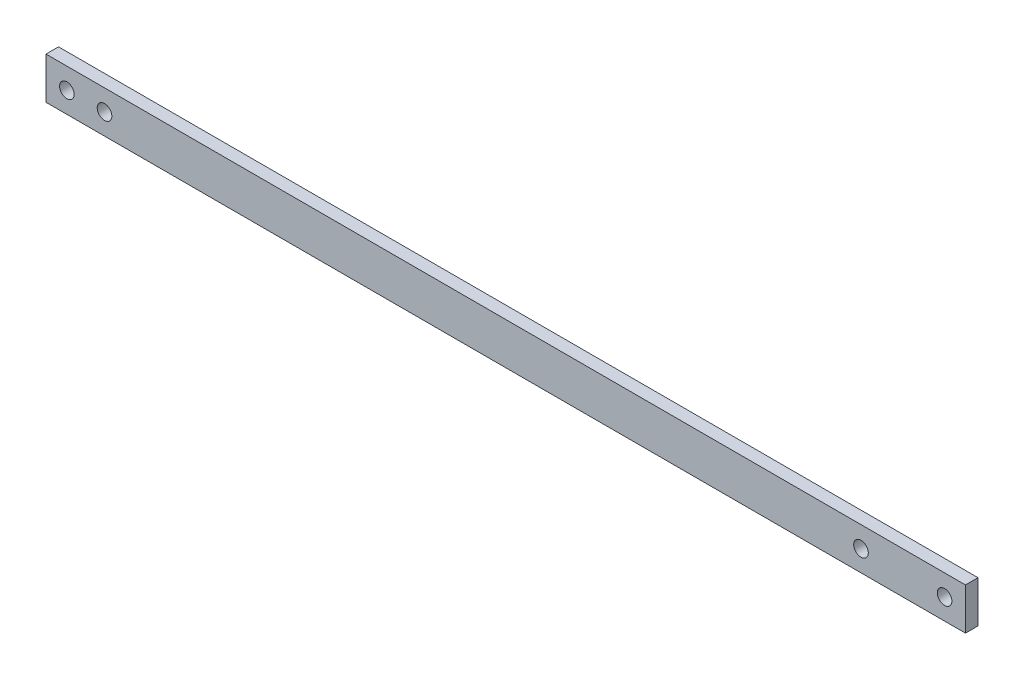
ISO-10303-21;
HEADER;
FILE_DESCRIPTION(('STEP AP214'),'2;1');
FILE_NAME('part.step','',(''),(''),'','','');
FILE_SCHEMA(('AUTOMOTIVE_DESIGN { 1 0 10303 214 1 1 1 1 }'));
ENDSEC;
DATA;
#1=APPLICATION_CONTEXT('core data for automotive mechanical design processes');
#2=APPLICATION_PROTOCOL_DEFINITION('international standard','automotive_design',2000,#1);
#3=PRODUCT_CONTEXT('',#1,'mechanical');
#4=PRODUCT('Part','Part','',(#3));
#5=PRODUCT_RELATED_PRODUCT_CATEGORY('part','',(#4));
#6=PRODUCT_DEFINITION_FORMATION('','',#4);
#7=PRODUCT_DEFINITION_CONTEXT('part definition',#1,'design');
#8=PRODUCT_DEFINITION('design','',#6,#7);
#9=PRODUCT_DEFINITION_SHAPE('','',#8);
#10=(LENGTH_UNIT() NAMED_UNIT(*) SI_UNIT(.MILLI.,.METRE.));
#11=(NAMED_UNIT(*) PLANE_ANGLE_UNIT() SI_UNIT($,.RADIAN.));
#12=(NAMED_UNIT(*) SI_UNIT($,.STERADIAN.) SOLID_ANGLE_UNIT());
#13=UNCERTAINTY_MEASURE_WITH_UNIT(LENGTH_MEASURE(1.E-05),#10,'distance_accuracy_value','');
#14=(GEOMETRIC_REPRESENTATION_CONTEXT(3) GLOBAL_UNCERTAINTY_ASSIGNED_CONTEXT((#13)) GLOBAL_UNIT_ASSIGNED_CONTEXT((#10,
#11,#12)) REPRESENTATION_CONTEXT('',''));
#15=CARTESIAN_POINT('',(0.,0.,0.));
#16=DIRECTION('',(0.,0.,1.));
#17=DIRECTION('',(1.,0.,0.));
#18=AXIS2_PLACEMENT_3D('',#15,#16,#17);
#19=CARTESIAN_POINT('',(0.,0.,3.));
#20=DIRECTION('',(0.,1.,0.));
#21=DIRECTION('',(-1.,0.,0.));
#22=AXIS2_PLACEMENT_3D('',#19,#20,#21);
#23=PLANE('',#22);
#24=DIRECTION('',(1.,0.,0.));
#25=VECTOR('',#24,1.);
#26=CARTESIAN_POINT('',(0.,0.,0.));
#27=LINE('',#26,#25);
#28=CARTESIAN_POINT('',(0.,0.,0.));
#29=VERTEX_POINT('',#28);
#30=CARTESIAN_POINT('',(220.,0.,0.));
#31=VERTEX_POINT('',#30);
#32=EDGE_CURVE('E117',#29,#31,#27,.T.);
#33=ORIENTED_EDGE('',*,*,#32,.T.);
#34=DIRECTION('',(0.,0.,-1.));
#35=VECTOR('',#34,1.);
#36=CARTESIAN_POINT('',(220.,0.,3.));
#37=LINE('',#36,#35);
#38=CARTESIAN_POINT('',(220.,0.,3.));
#39=VERTEX_POINT('',#38);
#40=EDGE_CURVE('E11',#39,#31,#37,.T.);
#41=ORIENTED_EDGE('',*,*,#40,.F.);
#42=DIRECTION('',(1.,0.,0.));
#43=VECTOR('',#42,1.);
#44=CARTESIAN_POINT('',(0.,0.,3.));
#45=LINE('',#44,#43);
#46=CARTESIAN_POINT('',(0.,0.,3.));
#47=VERTEX_POINT('',#46);
#48=EDGE_CURVE('E81',#47,#39,#45,.T.);
#49=ORIENTED_EDGE('',*,*,#48,.F.);
#50=DIRECTION('',(0.,0.,-1.));
#51=VECTOR('',#50,1.);
#52=CARTESIAN_POINT('',(0.,0.,3.));
#53=LINE('',#52,#51);
#54=EDGE_CURVE('E57',#47,#29,#53,.T.);
#55=ORIENTED_EDGE('',*,*,#54,.T.);
#56=EDGE_LOOP('',(#33,#41,#49,#55));
#57=FACE_BOUND('',#56,.T.);
#58=ADVANCED_FACE('F41',(#57),#23,.F.);
#59=CARTESIAN_POINT('',(220.,0.,3.));
#60=DIRECTION('',(1.,0.,0.));
#61=DIRECTION('',(0.,0.,-1.));
#62=AXIS2_PLACEMENT_3D('',#59,#60,#61);
#63=PLANE('',#62);
#64=DIRECTION('',(0.,-1.,0.));
#65=VECTOR('',#64,1.);
#66=CARTESIAN_POINT('',(220.,0.,0.));
#67=LINE('',#66,#65);
#68=CARTESIAN_POINT('',(220.,10.,0.));
#69=VERTEX_POINT('',#68);
#70=EDGE_CURVE('E90',#69,#31,#67,.T.);
#71=ORIENTED_EDGE('',*,*,#70,.F.);
#72=DIRECTION('',(0.,0.,-1.));
#73=VECTOR('',#72,1.);
#74=CARTESIAN_POINT('',(220.,10.,3.));
#75=LINE('',#74,#73);
#76=CARTESIAN_POINT('',(220.,10.,3.));
#77=VERTEX_POINT('',#76);
#78=EDGE_CURVE('E49',#77,#69,#75,.T.);
#79=ORIENTED_EDGE('',*,*,#78,.F.);
#80=DIRECTION('',(0.,-1.,0.));
#81=VECTOR('',#80,1.);
#82=CARTESIAN_POINT('',(220.,0.,3.));
#83=LINE('',#82,#81);
#84=EDGE_CURVE('E88',#77,#39,#83,.T.);
#85=ORIENTED_EDGE('',*,*,#84,.T.);
#86=ORIENTED_EDGE('',*,*,#40,.T.);
#87=EDGE_LOOP('',(#71,#79,#85,#86));
#88=FACE_BOUND('',#87,.T.);
#89=ADVANCED_FACE('F87',(#88),#63,.T.);
#90=CARTESIAN_POINT('',(0.,10.,3.));
#91=DIRECTION('',(0.,1.,0.));
#92=DIRECTION('',(-1.,0.,0.));
#93=AXIS2_PLACEMENT_3D('',#90,#91,#92);
#94=PLANE('',#93);
#95=DIRECTION('',(1.,0.,0.));
#96=VECTOR('',#95,1.);
#97=CARTESIAN_POINT('',(0.,10.,0.));
#98=LINE('',#97,#96);
#99=CARTESIAN_POINT('',(0.,10.,0.));
#100=VERTEX_POINT('',#99);
#101=EDGE_CURVE('E120',#100,#69,#98,.T.);
#102=ORIENTED_EDGE('',*,*,#101,.F.);
#103=DIRECTION('',(0.,0.,-1.));
#104=VECTOR('',#103,1.);
#105=CARTESIAN_POINT('',(0.,10.,3.));
#106=LINE('',#105,#104);
#107=CARTESIAN_POINT('',(0.,10.,3.));
#108=VERTEX_POINT('',#107);
#109=EDGE_CURVE('E70',#108,#100,#106,.T.);
#110=ORIENTED_EDGE('',*,*,#109,.F.);
#111=DIRECTION('',(1.,0.,0.));
#112=VECTOR('',#111,1.);
#113=CARTESIAN_POINT('',(0.,10.,3.));
#114=LINE('',#113,#112);
#115=EDGE_CURVE('E97',#108,#77,#114,.T.);
#116=ORIENTED_EDGE('',*,*,#115,.T.);
#117=ORIENTED_EDGE('',*,*,#78,.T.);
#118=EDGE_LOOP('',(#102,#110,#116,#117));
#119=FACE_BOUND('',#118,.T.);
#120=ADVANCED_FACE('F99',(#119),#94,.T.);
#121=CARTESIAN_POINT('',(195.,5.00000000000002,3.));
#122=DIRECTION('',(0.,0.,-1.));
#123=DIRECTION('',(-1.,0.,0.));
#124=AXIS2_PLACEMENT_3D('',#121,#122,#123);
#125=CYLINDRICAL_SURFACE('',#124,1.75000000000001);
#126=CARTESIAN_POINT('',(195.,5.00000000000002,3.));
#127=DIRECTION('',(0.,0.,1.));
#128=DIRECTION('',(1.,0.,0.));
#129=AXIS2_PLACEMENT_3D('',#126,#127,#128);
#130=CIRCLE('',#129,1.75000000000001);
#131=CARTESIAN_POINT('',(196.75,5.00000000000002,3.));
#132=VERTEX_POINT('',#131);
#133=EDGE_CURVE('E111',#132,#132,#130,.F.);
#134=ORIENTED_EDGE('',*,*,#133,.F.);
#135=EDGE_LOOP('',(#134));
#136=FACE_BOUND('',#135,.T.);
#137=CARTESIAN_POINT('',(195.,5.00000000000002,0.));
#138=DIRECTION('',(0.,0.,1.));
#139=DIRECTION('',(1.,0.,0.));
#140=AXIS2_PLACEMENT_3D('',#137,#138,#139);
#141=CIRCLE('',#140,1.75000000000001);
#142=CARTESIAN_POINT('',(196.75,5.00000000000002,0.));
#143=VERTEX_POINT('',#142);
#144=EDGE_CURVE('E131',#143,#143,#141,.F.);
#145=ORIENTED_EDGE('',*,*,#144,.T.);
#146=EDGE_LOOP('',(#145));
#147=FACE_BOUND('',#146,.T.);
#148=ADVANCED_FACE('F169',(#136,#147),#125,.F.);
#149=CARTESIAN_POINT('',(14.,5.,3.));
#150=DIRECTION('',(0.,0.,-1.));
#151=DIRECTION('',(-1.,0.,0.));
#152=AXIS2_PLACEMENT_3D('',#149,#150,#151);
#153=CYLINDRICAL_SURFACE('',#152,1.75);
#154=CARTESIAN_POINT('',(14.,5.,3.));
#155=DIRECTION('',(0.,0.,1.));
#156=DIRECTION('',(1.,0.,0.));
#157=AXIS2_PLACEMENT_3D('',#154,#155,#156);
#158=CIRCLE('',#157,1.75);
#159=CARTESIAN_POINT('',(15.75,5.,3.));
#160=VERTEX_POINT('',#159);
#161=EDGE_CURVE('E108',#160,#160,#158,.T.);
#162=ORIENTED_EDGE('',*,*,#161,.T.);
#163=EDGE_LOOP('',(#162));
#164=FACE_BOUND('',#163,.T.);
#165=CARTESIAN_POINT('',(14.,5.,0.));
#166=DIRECTION('',(0.,0.,1.));
#167=DIRECTION('',(1.,0.,0.));
#168=AXIS2_PLACEMENT_3D('',#165,#166,#167);
#169=CIRCLE('',#168,1.75);
#170=CARTESIAN_POINT('',(15.75,5.,0.));
#171=VERTEX_POINT('',#170);
#172=EDGE_CURVE('E128',#171,#171,#169,.T.);
#173=ORIENTED_EDGE('',*,*,#172,.F.);
#174=EDGE_LOOP('',(#173));
#175=FACE_BOUND('',#174,.T.);
#176=ADVANCED_FACE('F171',(#164,#175),#153,.F.);
#177=CARTESIAN_POINT('',(5.,5.,3.));
#178=DIRECTION('',(0.,0.,-1.));
#179=DIRECTION('',(-1.,0.,0.));
#180=AXIS2_PLACEMENT_3D('',#177,#178,#179);
#181=CYLINDRICAL_SURFACE('',#180,1.75);
#182=CARTESIAN_POINT('',(5.,5.,3.));
#183=DIRECTION('',(0.,0.,1.));
#184=DIRECTION('',(1.,0.,0.));
#185=AXIS2_PLACEMENT_3D('',#182,#183,#184);
#186=CIRCLE('',#185,1.75);
#187=CARTESIAN_POINT('',(6.75,5.,3.));
#188=VERTEX_POINT('',#187);
#189=EDGE_CURVE('E102',#188,#188,#186,.T.);
#190=ORIENTED_EDGE('',*,*,#189,.T.);
#191=EDGE_LOOP('',(#190));
#192=FACE_BOUND('',#191,.T.);
#193=CARTESIAN_POINT('',(5.,5.,0.));
#194=DIRECTION('',(0.,0.,1.));
#195=DIRECTION('',(1.,0.,0.));
#196=AXIS2_PLACEMENT_3D('',#193,#194,#195);
#197=CIRCLE('',#196,1.75);
#198=CARTESIAN_POINT('',(6.75,5.,0.));
#199=VERTEX_POINT('',#198);
#200=EDGE_CURVE('E125',#199,#199,#197,.T.);
#201=ORIENTED_EDGE('',*,*,#200,.F.);
#202=EDGE_LOOP('',(#201));
#203=FACE_BOUND('',#202,.T.);
#204=ADVANCED_FACE('F152',(#192,#203),#181,.F.);
#205=CARTESIAN_POINT('',(0.,0.,3.));
#206=DIRECTION('',(-1.,0.,0.));
#207=DIRECTION('',(0.,0.,1.));
#208=AXIS2_PLACEMENT_3D('',#205,#206,#207);
#209=PLANE('',#208);
#210=DIRECTION('',(0.,1.,0.));
#211=VECTOR('',#210,1.);
#212=CARTESIAN_POINT('',(0.,0.,0.));
#213=LINE('',#212,#211);
#214=EDGE_CURVE('E122',#29,#100,#213,.T.);
#215=ORIENTED_EDGE('',*,*,#214,.F.);
#216=ORIENTED_EDGE('',*,*,#54,.F.);
#217=DIRECTION('',(0.,1.,0.));
#218=VECTOR('',#217,1.);
#219=CARTESIAN_POINT('',(0.,0.,3.));
#220=LINE('',#219,#218);
#221=EDGE_CURVE('E100',#47,#108,#220,.T.);
#222=ORIENTED_EDGE('',*,*,#221,.T.);
#223=ORIENTED_EDGE('',*,*,#109,.T.);
#224=EDGE_LOOP('',(#215,#216,#222,#223));
#225=FACE_BOUND('',#224,.T.);
#226=ADVANCED_FACE('F144',(#225),#209,.T.);
#227=CARTESIAN_POINT('',(215.,4.99999999999998,3.));
#228=DIRECTION('',(0.,0.,-1.));
#229=DIRECTION('',(-1.,0.,0.));
#230=AXIS2_PLACEMENT_3D('',#227,#228,#229);
#231=CYLINDRICAL_SURFACE('',#230,1.75000000000001);
#232=CARTESIAN_POINT('',(215.,4.99999999999998,3.));
#233=DIRECTION('',(0.,0.,1.));
#234=DIRECTION('',(1.,0.,0.));
#235=AXIS2_PLACEMENT_3D('',#232,#233,#234);
#236=CIRCLE('',#235,1.75000000000001);
#237=CARTESIAN_POINT('',(216.75,4.99999999999998,3.));
#238=VERTEX_POINT('',#237);
#239=EDGE_CURVE('E114',#238,#238,#236,.T.);
#240=ORIENTED_EDGE('',*,*,#239,.T.);
#241=EDGE_LOOP('',(#240));
#242=FACE_BOUND('',#241,.T.);
#243=CARTESIAN_POINT('',(215.,4.99999999999998,0.));
#244=DIRECTION('',(0.,0.,1.));
#245=DIRECTION('',(1.,0.,0.));
#246=AXIS2_PLACEMENT_3D('',#243,#244,#245);
#247=CIRCLE('',#246,1.75000000000001);
#248=CARTESIAN_POINT('',(216.75,4.99999999999998,0.));
#249=VERTEX_POINT('',#248);
#250=EDGE_CURVE('E134',#249,#249,#247,.T.);
#251=ORIENTED_EDGE('',*,*,#250,.F.);
#252=EDGE_LOOP('',(#251));
#253=FACE_BOUND('',#252,.T.);
#254=ADVANCED_FACE('F142',(#242,#253),#231,.F.);
#255=CARTESIAN_POINT('',(0.,0.,3.));
#256=DIRECTION('',(0.,0.,1.));
#257=DIRECTION('',(1.,0.,0.));
#258=AXIS2_PLACEMENT_3D('',#255,#256,#257);
#259=PLANE('',#258);
#260=ORIENTED_EDGE('',*,*,#48,.T.);
#261=ORIENTED_EDGE('',*,*,#84,.F.);
#262=ORIENTED_EDGE('',*,*,#115,.F.);
#263=ORIENTED_EDGE('',*,*,#221,.F.);
#264=EDGE_LOOP('',(#260,#261,#262,#263));
#265=FACE_BOUND('',#264,.T.);
#266=ORIENTED_EDGE('',*,*,#189,.F.);
#267=EDGE_LOOP('',(#266));
#268=FACE_BOUND('',#267,.T.);
#269=ORIENTED_EDGE('',*,*,#161,.F.);
#270=EDGE_LOOP('',(#269));
#271=FACE_BOUND('',#270,.T.);
#272=ORIENTED_EDGE('',*,*,#133,.T.);
#273=EDGE_LOOP('',(#272));
#274=FACE_BOUND('',#273,.T.);
#275=ORIENTED_EDGE('',*,*,#239,.F.);
#276=EDGE_LOOP('',(#275));
#277=FACE_BOUND('',#276,.T.);
#278=ADVANCED_FACE('F95',(#265,#268,#271,#274,#277),#259,.T.);
#279=CARTESIAN_POINT('',(0.,0.,0.));
#280=DIRECTION('',(0.,0.,1.));
#281=DIRECTION('',(1.,0.,0.));
#282=AXIS2_PLACEMENT_3D('',#279,#280,#281);
#283=PLANE('',#282);
#284=ORIENTED_EDGE('',*,*,#32,.F.);
#285=ORIENTED_EDGE('',*,*,#214,.T.);
#286=ORIENTED_EDGE('',*,*,#101,.T.);
#287=ORIENTED_EDGE('',*,*,#70,.T.);
#288=EDGE_LOOP('',(#284,#285,#286,#287));
#289=FACE_BOUND('',#288,.T.);
#290=ORIENTED_EDGE('',*,*,#200,.T.);
#291=EDGE_LOOP('',(#290));
#292=FACE_BOUND('',#291,.T.);
#293=ORIENTED_EDGE('',*,*,#172,.T.);
#294=EDGE_LOOP('',(#293));
#295=FACE_BOUND('',#294,.T.);
#296=ORIENTED_EDGE('',*,*,#144,.F.);
#297=EDGE_LOOP('',(#296));
#298=FACE_BOUND('',#297,.T.);
#299=ORIENTED_EDGE('',*,*,#250,.T.);
#300=EDGE_LOOP('',(#299));
#301=FACE_BOUND('',#300,.T.);
#302=ADVANCED_FACE('F140',(#289,#292,#295,#298,#301),#283,.F.);
#303=CLOSED_SHELL('',(#58,#89,#120,#148,#176,#204,#226,#254,#278,#302));
#304=MANIFOLD_SOLID_BREP('B2',#303);
#305=ADVANCED_BREP_SHAPE_REPRESENTATION('',(#18,#304),#14);
#306=SHAPE_DEFINITION_REPRESENTATION(#9,#305);
ENDSEC;
END-ISO-10303-21;
